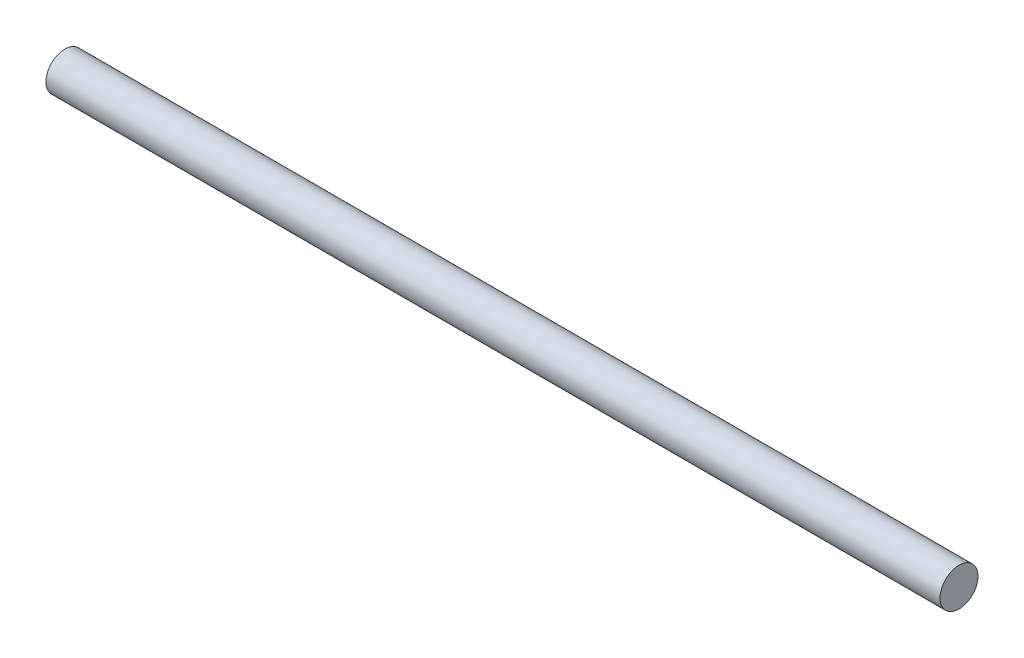
ISO-10303-21;
HEADER;
FILE_DESCRIPTION(('STEP AP214'),'2;1');
FILE_NAME('part.step','',(''),(''),'','','');
FILE_SCHEMA(('AUTOMOTIVE_DESIGN { 1 0 10303 214 1 1 1 1 }'));
ENDSEC;
DATA;
#1=APPLICATION_CONTEXT('core data for automotive mechanical design processes');
#2=APPLICATION_PROTOCOL_DEFINITION('international standard','automotive_design',2000,#1);
#3=PRODUCT_CONTEXT('',#1,'mechanical');
#4=PRODUCT('Part','Part','',(#3));
#5=PRODUCT_RELATED_PRODUCT_CATEGORY('part','',(#4));
#6=PRODUCT_DEFINITION_FORMATION('','',#4);
#7=PRODUCT_DEFINITION_CONTEXT('part definition',#1,'design');
#8=PRODUCT_DEFINITION('design','',#6,#7);
#9=PRODUCT_DEFINITION_SHAPE('','',#8);
#10=(LENGTH_UNIT() NAMED_UNIT(*) SI_UNIT(.MILLI.,.METRE.));
#11=(NAMED_UNIT(*) PLANE_ANGLE_UNIT() SI_UNIT($,.RADIAN.));
#12=(NAMED_UNIT(*) SI_UNIT($,.STERADIAN.) SOLID_ANGLE_UNIT());
#13=UNCERTAINTY_MEASURE_WITH_UNIT(LENGTH_MEASURE(1.E-05),#10,'distance_accuracy_value','');
#14=(GEOMETRIC_REPRESENTATION_CONTEXT(3) GLOBAL_UNCERTAINTY_ASSIGNED_CONTEXT((#13)) GLOBAL_UNIT_ASSIGNED_CONTEXT((#10,
#11,#12)) REPRESENTATION_CONTEXT('',''));
#15=CARTESIAN_POINT('',(0.,0.,0.));
#16=DIRECTION('',(0.,0.,1.));
#17=DIRECTION('',(1.,0.,0.));
#18=AXIS2_PLACEMENT_3D('',#15,#16,#17);
#19=CARTESIAN_POINT('',(41.275,0.,0.));
#20=DIRECTION('',(-1.,0.,0.));
#21=DIRECTION('',(0.,0.,1.));
#22=AXIS2_PLACEMENT_3D('',#19,#20,#21);
#23=CYLINDRICAL_SURFACE('',#22,1.7526);
#24=CARTESIAN_POINT('',(41.275,0.,0.));
#25=DIRECTION('',(1.,0.,0.));
#26=DIRECTION('',(0.,0.,-1.));
#27=AXIS2_PLACEMENT_3D('',#24,#25,#26);
#28=CIRCLE('',#27,1.7526);
#29=CARTESIAN_POINT('',(41.275,0.,-1.7526));
#30=VERTEX_POINT('',#29);
#31=EDGE_CURVE('E10',#30,#30,#28,.T.);
#32=ORIENTED_EDGE('',*,*,#31,.F.);
#33=EDGE_LOOP('',(#32));
#34=FACE_BOUND('',#33,.T.);
#35=CARTESIAN_POINT('',(-41.275,0.,0.));
#36=DIRECTION('',(1.,0.,0.));
#37=DIRECTION('',(0.,0.,-1.));
#38=AXIS2_PLACEMENT_3D('',#35,#36,#37);
#39=CIRCLE('',#38,1.7526);
#40=CARTESIAN_POINT('',(-41.275,0.,-1.7526));
#41=VERTEX_POINT('',#40);
#42=EDGE_CURVE('E44',#41,#41,#39,.T.);
#43=ORIENTED_EDGE('',*,*,#42,.T.);
#44=EDGE_LOOP('',(#43));
#45=FACE_BOUND('',#44,.T.);
#46=ADVANCED_FACE('F41',(#34,#45),#23,.T.);
#47=CARTESIAN_POINT('',(41.275,0.,0.));
#48=DIRECTION('',(1.,0.,0.));
#49=DIRECTION('',(0.,0.,-1.));
#50=AXIS2_PLACEMENT_3D('',#47,#48,#49);
#51=PLANE('',#50);
#52=ORIENTED_EDGE('',*,*,#31,.T.);
#53=EDGE_LOOP('',(#52));
#54=FACE_BOUND('',#53,.T.);
#55=ADVANCED_FACE('F60',(#54),#51,.T.);
#56=CARTESIAN_POINT('',(-41.275,0.,0.));
#57=DIRECTION('',(1.,0.,0.));
#58=DIRECTION('',(0.,0.,-1.));
#59=AXIS2_PLACEMENT_3D('',#56,#57,#58);
#60=PLANE('',#59);
#61=ORIENTED_EDGE('',*,*,#42,.F.);
#62=EDGE_LOOP('',(#61));
#63=FACE_BOUND('',#62,.T.);
#64=ADVANCED_FACE('F58',(#63),#60,.F.);
#65=CLOSED_SHELL('',(#46,#55,#64));
#66=MANIFOLD_SOLID_BREP('B2',#65);
#67=ADVANCED_BREP_SHAPE_REPRESENTATION('',(#18,#66),#14);
#68=SHAPE_DEFINITION_REPRESENTATION(#9,#67);
ENDSEC;
END-ISO-10303-21;
